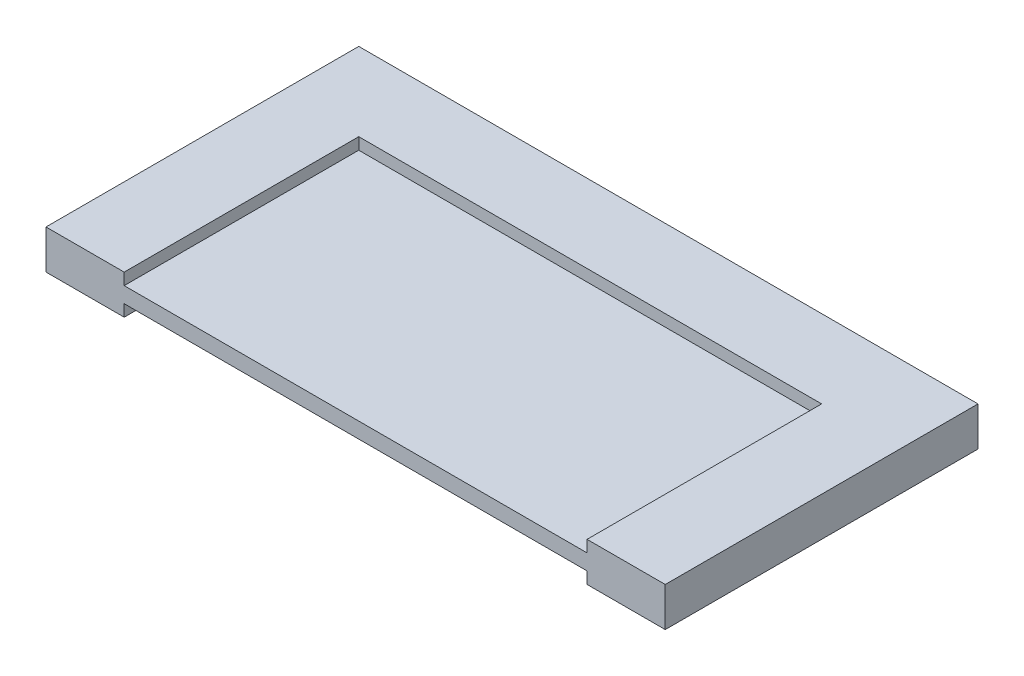
ISO-10303-21;
HEADER;
FILE_DESCRIPTION(('STEP AP214'),'2;1');
FILE_NAME('part.step','',(''),(''),'','','');
FILE_SCHEMA(('AUTOMOTIVE_DESIGN { 1 0 10303 214 1 1 1 1 }'));
ENDSEC;
DATA;
#1=APPLICATION_CONTEXT('core data for automotive mechanical design processes');
#2=APPLICATION_PROTOCOL_DEFINITION('international standard','automotive_design',2000,#1);
#3=PRODUCT_CONTEXT('',#1,'mechanical');
#4=PRODUCT('Part','Part','',(#3));
#5=PRODUCT_RELATED_PRODUCT_CATEGORY('part','',(#4));
#6=PRODUCT_DEFINITION_FORMATION('','',#4);
#7=PRODUCT_DEFINITION_CONTEXT('part definition',#1,'design');
#8=PRODUCT_DEFINITION('design','',#6,#7);
#9=PRODUCT_DEFINITION_SHAPE('','',#8);
#10=(LENGTH_UNIT() NAMED_UNIT(*) SI_UNIT(.MILLI.,.METRE.));
#11=(NAMED_UNIT(*) PLANE_ANGLE_UNIT() SI_UNIT($,.RADIAN.));
#12=(NAMED_UNIT(*) SI_UNIT($,.STERADIAN.) SOLID_ANGLE_UNIT());
#13=UNCERTAINTY_MEASURE_WITH_UNIT(LENGTH_MEASURE(1.E-05),#10,'distance_accuracy_value','');
#14=(GEOMETRIC_REPRESENTATION_CONTEXT(3) GLOBAL_UNCERTAINTY_ASSIGNED_CONTEXT((#13)) GLOBAL_UNIT_ASSIGNED_CONTEXT((#10,
#11,#12)) REPRESENTATION_CONTEXT('',''));
#15=CARTESIAN_POINT('',(0.,0.,0.));
#16=DIRECTION('',(0.,0.,1.));
#17=DIRECTION('',(1.,0.,0.));
#18=AXIS2_PLACEMENT_3D('',#15,#16,#17);
#19=CARTESIAN_POINT('',(-18.796,1.5875,0.));
#20=DIRECTION('',(-1.,0.,0.));
#21=DIRECTION('',(0.,0.,1.));
#22=AXIS2_PLACEMENT_3D('',#19,#20,#21);
#23=PLANE('',#22);
#24=DIRECTION('',(0.,0.,1.));
#25=VECTOR('',#24,1.);
#26=CARTESIAN_POINT('',(-18.796,-0.635,-19.05));
#27=LINE('',#26,#25);
#28=CARTESIAN_POINT('',(-18.796,-0.635,-19.05));
#29=VERTEX_POINT('',#28);
#30=CARTESIAN_POINT('',(-18.796,-0.635,0.));
#31=VERTEX_POINT('',#30);
#32=EDGE_CURVE('E189',#29,#31,#27,.T.);
#33=ORIENTED_EDGE('',*,*,#32,.T.);
#34=DIRECTION('',(0.,-1.,0.));
#35=VECTOR('',#34,1.);
#36=CARTESIAN_POINT('',(-18.796,1.5875,0.));
#37=LINE('',#36,#35);
#38=CARTESIAN_POINT('',(-18.796,-1.5875,0.));
#39=VERTEX_POINT('',#38);
#40=EDGE_CURVE('E175',#31,#39,#37,.T.);
#41=ORIENTED_EDGE('',*,*,#40,.T.);
#42=DIRECTION('',(0.,0.,-1.));
#43=VECTOR('',#42,1.);
#44=CARTESIAN_POINT('',(-18.796,-1.5875,0.));
#45=LINE('',#44,#43);
#46=CARTESIAN_POINT('',(-18.796,-1.5875,-19.05));
#47=VERTEX_POINT('',#46);
#48=EDGE_CURVE('E150',#39,#47,#45,.T.);
#49=ORIENTED_EDGE('',*,*,#48,.T.);
#50=DIRECTION('',(0.,-1.,0.));
#51=VECTOR('',#50,1.);
#52=CARTESIAN_POINT('',(-18.796,1.5875,-19.05));
#53=LINE('',#52,#51);
#54=EDGE_CURVE('E172',#29,#47,#53,.T.);
#55=ORIENTED_EDGE('',*,*,#54,.F.);
#56=EDGE_LOOP('',(#33,#41,#49,#55));
#57=FACE_BOUND('',#56,.T.);
#58=ADVANCED_FACE('F35',(#57),#23,.F.);
#59=CARTESIAN_POINT('',(-18.796,1.5875,-19.05));
#60=DIRECTION('',(0.,0.,-1.));
#61=DIRECTION('',(-1.,0.,0.));
#62=AXIS2_PLACEMENT_3D('',#59,#60,#61);
#63=PLANE('',#62);
#64=DIRECTION('',(-1.,0.,0.));
#65=VECTOR('',#64,1.);
#66=CARTESIAN_POINT('',(-18.796,-0.635,-19.05));
#67=LINE('',#66,#65);
#68=CARTESIAN_POINT('',(18.796,-0.635,-19.05));
#69=VERTEX_POINT('',#68);
#70=EDGE_CURVE('E200',#69,#29,#67,.T.);
#71=ORIENTED_EDGE('',*,*,#70,.T.);
#72=ORIENTED_EDGE('',*,*,#54,.T.);
#73=DIRECTION('',(1.,0.,0.));
#74=VECTOR('',#73,1.);
#75=CARTESIAN_POINT('',(-18.796,-1.5875,-19.05));
#76=LINE('',#75,#74);
#77=CARTESIAN_POINT('',(18.796,-1.5875,-19.05));
#78=VERTEX_POINT('',#77);
#79=EDGE_CURVE('E153',#47,#78,#76,.T.);
#80=ORIENTED_EDGE('',*,*,#79,.T.);
#81=DIRECTION('',(0.,-1.,0.));
#82=VECTOR('',#81,1.);
#83=CARTESIAN_POINT('',(18.796,1.5875,-19.05));
#84=LINE('',#83,#82);
#85=EDGE_CURVE('E168',#69,#78,#84,.T.);
#86=ORIENTED_EDGE('',*,*,#85,.F.);
#87=EDGE_LOOP('',(#71,#72,#80,#86));
#88=FACE_BOUND('',#87,.T.);
#89=ADVANCED_FACE('F198',(#88),#63,.F.);
#90=CARTESIAN_POINT('',(18.796,1.5875,0.));
#91=DIRECTION('',(1.,0.,0.));
#92=DIRECTION('',(0.,0.,-1.));
#93=AXIS2_PLACEMENT_3D('',#90,#91,#92);
#94=PLANE('',#93);
#95=DIRECTION('',(0.,0.,-1.));
#96=VECTOR('',#95,1.);
#97=CARTESIAN_POINT('',(18.796,-0.635,-19.05));
#98=LINE('',#97,#96);
#99=CARTESIAN_POINT('',(18.796,-0.635,0.));
#100=VERTEX_POINT('',#99);
#101=EDGE_CURVE('E50',#100,#69,#98,.T.);
#102=ORIENTED_EDGE('',*,*,#101,.T.);
#103=ORIENTED_EDGE('',*,*,#85,.T.);
#104=DIRECTION('',(0.,0.,1.));
#105=VECTOR('',#104,1.);
#106=CARTESIAN_POINT('',(18.796,-1.5875,0.));
#107=LINE('',#106,#105);
#108=CARTESIAN_POINT('',(18.796,-1.5875,0.));
#109=VERTEX_POINT('',#108);
#110=EDGE_CURVE('E156',#78,#109,#107,.T.);
#111=ORIENTED_EDGE('',*,*,#110,.T.);
#112=DIRECTION('',(0.,-1.,0.));
#113=VECTOR('',#112,1.);
#114=CARTESIAN_POINT('',(18.796,1.5875,0.));
#115=LINE('',#114,#113);
#116=EDGE_CURVE('E134',#100,#109,#115,.T.);
#117=ORIENTED_EDGE('',*,*,#116,.F.);
#118=EDGE_LOOP('',(#102,#103,#111,#117));
#119=FACE_BOUND('',#118,.T.);
#120=ADVANCED_FACE('F249',(#119),#94,.F.);
#121=CARTESIAN_POINT('',(-25.146,1.5875,-25.4));
#122=DIRECTION('',(1.,0.,0.));
#123=DIRECTION('',(0.,0.,-1.));
#124=AXIS2_PLACEMENT_3D('',#121,#122,#123);
#125=PLANE('',#124);
#126=DIRECTION('',(0.,0.,1.));
#127=VECTOR('',#126,1.);
#128=CARTESIAN_POINT('',(-25.146,-1.5875,-25.4));
#129=LINE('',#128,#127);
#130=CARTESIAN_POINT('',(-25.146,-1.5875,-25.4));
#131=VERTEX_POINT('',#130);
#132=CARTESIAN_POINT('',(-25.146,-1.5875,0.));
#133=VERTEX_POINT('',#132);
#134=EDGE_CURVE('E143',#131,#133,#129,.T.);
#135=ORIENTED_EDGE('',*,*,#134,.T.);
#136=DIRECTION('',(0.,-1.,0.));
#137=VECTOR('',#136,1.);
#138=CARTESIAN_POINT('',(-25.146,1.5875,0.));
#139=LINE('',#138,#137);
#140=CARTESIAN_POINT('',(-25.146,1.5875,0.));
#141=VERTEX_POINT('',#140);
#142=EDGE_CURVE('E11',#141,#133,#139,.T.);
#143=ORIENTED_EDGE('',*,*,#142,.F.);
#144=DIRECTION('',(0.,0.,1.));
#145=VECTOR('',#144,1.);
#146=CARTESIAN_POINT('',(-25.146,1.5875,-25.4));
#147=LINE('',#146,#145);
#148=CARTESIAN_POINT('',(-25.146,1.5875,-25.4));
#149=VERTEX_POINT('',#148);
#150=EDGE_CURVE('E163',#149,#141,#147,.T.);
#151=ORIENTED_EDGE('',*,*,#150,.F.);
#152=DIRECTION('',(0.,-1.,0.));
#153=VECTOR('',#152,1.);
#154=CARTESIAN_POINT('',(-25.146,1.5875,-25.4));
#155=LINE('',#154,#153);
#156=EDGE_CURVE('E139',#149,#131,#155,.T.);
#157=ORIENTED_EDGE('',*,*,#156,.T.);
#158=EDGE_LOOP('',(#135,#143,#151,#157));
#159=FACE_BOUND('',#158,.T.);
#160=ADVANCED_FACE('F37',(#159),#125,.F.);
#161=CARTESIAN_POINT('',(-18.796,1.5875,0.));
#162=VERTEX_POINT('',#161);
#163=CARTESIAN_POINT('',(-18.796,0.635,0.));
#164=VERTEX_POINT('',#163);
#165=EDGE_CURVE('E43',#162,#164,#37,.T.);
#166=ORIENTED_EDGE('',*,*,#165,.T.);
#167=DIRECTION('',(0.,0.,1.));
#168=VECTOR('',#167,1.);
#169=CARTESIAN_POINT('',(-18.796,0.635,-19.05));
#170=LINE('',#169,#168);
#171=CARTESIAN_POINT('',(-18.796,0.635,-19.05));
#172=VERTEX_POINT('',#171);
#173=EDGE_CURVE('E219',#172,#164,#170,.T.);
#174=ORIENTED_EDGE('',*,*,#173,.F.);
#175=CARTESIAN_POINT('',(-18.796,1.5875,-19.05));
#176=VERTEX_POINT('',#175);
#177=EDGE_CURVE('E173',#176,#172,#53,.T.);
#178=ORIENTED_EDGE('',*,*,#177,.F.);
#179=DIRECTION('',(0.,0.,-1.));
#180=VECTOR('',#179,1.);
#181=CARTESIAN_POINT('',(-18.796,1.5875,0.));
#182=LINE('',#181,#180);
#183=EDGE_CURVE('E235',#162,#176,#182,.T.);
#184=ORIENTED_EDGE('',*,*,#183,.F.);
#185=EDGE_LOOP('',(#166,#174,#178,#184));
#186=FACE_BOUND('',#185,.T.);
#187=ADVANCED_FACE('F242',(#186),#23,.F.);
#188=ORIENTED_EDGE('',*,*,#177,.T.);
#189=DIRECTION('',(-1.,0.,0.));
#190=VECTOR('',#189,1.);
#191=CARTESIAN_POINT('',(-18.796,0.635,-19.05));
#192=LINE('',#191,#190);
#193=CARTESIAN_POINT('',(18.796,0.635,-19.05));
#194=VERTEX_POINT('',#193);
#195=EDGE_CURVE('E147',#194,#172,#192,.T.);
#196=ORIENTED_EDGE('',*,*,#195,.F.);
#197=CARTESIAN_POINT('',(18.796,1.5875,-19.05));
#198=VERTEX_POINT('',#197);
#199=EDGE_CURVE('E169',#198,#194,#84,.T.);
#200=ORIENTED_EDGE('',*,*,#199,.F.);
#201=DIRECTION('',(1.,0.,0.));
#202=VECTOR('',#201,1.);
#203=CARTESIAN_POINT('',(-18.796,1.5875,-19.05));
#204=LINE('',#203,#202);
#205=EDGE_CURVE('E237',#176,#198,#204,.T.);
#206=ORIENTED_EDGE('',*,*,#205,.F.);
#207=EDGE_LOOP('',(#188,#196,#200,#206));
#208=FACE_BOUND('',#207,.T.);
#209=ADVANCED_FACE('F241',(#208),#63,.F.);
#210=ORIENTED_EDGE('',*,*,#199,.T.);
#211=DIRECTION('',(0.,0.,-1.));
#212=VECTOR('',#211,1.);
#213=CARTESIAN_POINT('',(18.796,0.635,-19.05));
#214=LINE('',#213,#212);
#215=CARTESIAN_POINT('',(18.796,0.635,0.));
#216=VERTEX_POINT('',#215);
#217=EDGE_CURVE('E217',#216,#194,#214,.T.);
#218=ORIENTED_EDGE('',*,*,#217,.F.);
#219=CARTESIAN_POINT('',(18.796,1.5875,0.));
#220=VERTEX_POINT('',#219);
#221=EDGE_CURVE('E166',#220,#216,#115,.T.);
#222=ORIENTED_EDGE('',*,*,#221,.F.);
#223=DIRECTION('',(0.,0.,1.));
#224=VECTOR('',#223,1.);
#225=CARTESIAN_POINT('',(18.796,1.5875,0.));
#226=LINE('',#225,#224);
#227=EDGE_CURVE('E123',#198,#220,#226,.T.);
#228=ORIENTED_EDGE('',*,*,#227,.F.);
#229=EDGE_LOOP('',(#210,#218,#222,#228));
#230=FACE_BOUND('',#229,.T.);
#231=ADVANCED_FACE('F222',(#230),#94,.F.);
#232=CARTESIAN_POINT('',(25.146,1.5875,0.));
#233=DIRECTION('',(0.,0.,-1.));
#234=DIRECTION('',(-1.,0.,0.));
#235=AXIS2_PLACEMENT_3D('',#232,#233,#234);
#236=PLANE('',#235);
#237=DIRECTION('',(1.,0.,0.));
#238=VECTOR('',#237,1.);
#239=CARTESIAN_POINT('',(25.146,-1.5875,0.));
#240=LINE('',#239,#238);
#241=CARTESIAN_POINT('',(25.146,-1.5875,0.));
#242=VERTEX_POINT('',#241);
#243=EDGE_CURVE('E131',#109,#242,#240,.T.);
#244=ORIENTED_EDGE('',*,*,#243,.T.);
#245=DIRECTION('',(0.,-1.,0.));
#246=VECTOR('',#245,1.);
#247=CARTESIAN_POINT('',(25.146,1.5875,0.));
#248=LINE('',#247,#246);
#249=CARTESIAN_POINT('',(25.146,1.5875,0.));
#250=VERTEX_POINT('',#249);
#251=EDGE_CURVE('E128',#250,#242,#248,.T.);
#252=ORIENTED_EDGE('',*,*,#251,.F.);
#253=DIRECTION('',(1.,0.,0.));
#254=VECTOR('',#253,1.);
#255=CARTESIAN_POINT('',(25.146,1.5875,0.));
#256=LINE('',#255,#254);
#257=EDGE_CURVE('E116',#220,#250,#256,.T.);
#258=ORIENTED_EDGE('',*,*,#257,.F.);
#259=ORIENTED_EDGE('',*,*,#221,.T.);
#260=DIRECTION('',(1.,0.,0.));
#261=VECTOR('',#260,1.);
#262=CARTESIAN_POINT('',(-18.796,0.635,0.));
#263=LINE('',#262,#261);
#264=EDGE_CURVE('E214',#164,#216,#263,.T.);
#265=ORIENTED_EDGE('',*,*,#264,.F.);
#266=ORIENTED_EDGE('',*,*,#165,.F.);
#267=DIRECTION('',(1.,0.,0.));
#268=VECTOR('',#267,1.);
#269=CARTESIAN_POINT('',(-25.146,1.5875,0.));
#270=LINE('',#269,#268);
#271=EDGE_CURVE('E100',#141,#162,#270,.T.);
#272=ORIENTED_EDGE('',*,*,#271,.F.);
#273=ORIENTED_EDGE('',*,*,#142,.T.);
#274=DIRECTION('',(1.,0.,0.));
#275=VECTOR('',#274,1.);
#276=CARTESIAN_POINT('',(-25.146,-1.5875,0.));
#277=LINE('',#276,#275);
#278=EDGE_CURVE('E146',#133,#39,#277,.T.);
#279=ORIENTED_EDGE('',*,*,#278,.T.);
#280=ORIENTED_EDGE('',*,*,#40,.F.);
#281=DIRECTION('',(1.,0.,0.));
#282=VECTOR('',#281,1.);
#283=CARTESIAN_POINT('',(-18.796,-0.635,0.));
#284=LINE('',#283,#282);
#285=EDGE_CURVE('E229',#31,#100,#284,.T.);
#286=ORIENTED_EDGE('',*,*,#285,.T.);
#287=ORIENTED_EDGE('',*,*,#116,.T.);
#288=EDGE_LOOP('',(#244,#252,#258,#259,#265,#266,#272,#273,#279,#280,#286,#287));
#289=FACE_BOUND('',#288,.T.);
#290=ADVANCED_FACE('F129',(#289),#236,.F.);
#291=CARTESIAN_POINT('',(25.146,1.5875,-25.4));
#292=DIRECTION('',(-1.,0.,0.));
#293=DIRECTION('',(0.,0.,1.));
#294=AXIS2_PLACEMENT_3D('',#291,#292,#293);
#295=PLANE('',#294);
#296=DIRECTION('',(0.,0.,-1.));
#297=VECTOR('',#296,1.);
#298=CARTESIAN_POINT('',(25.146,-1.5875,-25.4));
#299=LINE('',#298,#297);
#300=CARTESIAN_POINT('',(25.146,-1.5875,-25.4));
#301=VERTEX_POINT('',#300);
#302=EDGE_CURVE('E160',#242,#301,#299,.T.);
#303=ORIENTED_EDGE('',*,*,#302,.T.);
#304=DIRECTION('',(0.,-1.,0.));
#305=VECTOR('',#304,1.);
#306=CARTESIAN_POINT('',(25.146,1.5875,-25.4));
#307=LINE('',#306,#305);
#308=CARTESIAN_POINT('',(25.146,1.5875,-25.4));
#309=VERTEX_POINT('',#308);
#310=EDGE_CURVE('E135',#309,#301,#307,.T.);
#311=ORIENTED_EDGE('',*,*,#310,.F.);
#312=DIRECTION('',(0.,0.,-1.));
#313=VECTOR('',#312,1.);
#314=CARTESIAN_POINT('',(25.146,1.5875,-25.4));
#315=LINE('',#314,#313);
#316=EDGE_CURVE('E120',#250,#309,#315,.T.);
#317=ORIENTED_EDGE('',*,*,#316,.F.);
#318=ORIENTED_EDGE('',*,*,#251,.T.);
#319=EDGE_LOOP('',(#303,#311,#317,#318));
#320=FACE_BOUND('',#319,.T.);
#321=ADVANCED_FACE('F137',(#320),#295,.F.);
#322=CARTESIAN_POINT('',(25.146,1.5875,-25.4));
#323=DIRECTION('',(0.,0.,1.));
#324=DIRECTION('',(1.,0.,0.));
#325=AXIS2_PLACEMENT_3D('',#322,#323,#324);
#326=PLANE('',#325);
#327=DIRECTION('',(-1.,0.,0.));
#328=VECTOR('',#327,1.);
#329=CARTESIAN_POINT('',(25.146,-1.5875,-25.4));
#330=LINE('',#329,#328);
#331=EDGE_CURVE('E92',#301,#131,#330,.T.);
#332=ORIENTED_EDGE('',*,*,#331,.T.);
#333=ORIENTED_EDGE('',*,*,#156,.F.);
#334=DIRECTION('',(-1.,0.,0.));
#335=VECTOR('',#334,1.);
#336=CARTESIAN_POINT('',(25.146,1.5875,-25.4));
#337=LINE('',#336,#335);
#338=EDGE_CURVE('E59',#309,#149,#337,.T.);
#339=ORIENTED_EDGE('',*,*,#338,.F.);
#340=ORIENTED_EDGE('',*,*,#310,.T.);
#341=EDGE_LOOP('',(#332,#333,#339,#340));
#342=FACE_BOUND('',#341,.T.);
#343=ADVANCED_FACE('F266',(#342),#326,.F.);
#344=CARTESIAN_POINT('',(0.,1.5875,0.));
#345=DIRECTION('',(0.,1.,0.));
#346=DIRECTION('',(0.,0.,1.));
#347=AXIS2_PLACEMENT_3D('',#344,#345,#346);
#348=PLANE('',#347);
#349=ORIENTED_EDGE('',*,*,#150,.T.);
#350=ORIENTED_EDGE('',*,*,#271,.T.);
#351=ORIENTED_EDGE('',*,*,#183,.T.);
#352=ORIENTED_EDGE('',*,*,#205,.T.);
#353=ORIENTED_EDGE('',*,*,#227,.T.);
#354=ORIENTED_EDGE('',*,*,#257,.T.);
#355=ORIENTED_EDGE('',*,*,#316,.T.);
#356=ORIENTED_EDGE('',*,*,#338,.T.);
#357=EDGE_LOOP('',(#349,#350,#351,#352,#353,#354,#355,#356));
#358=FACE_BOUND('',#357,.T.);
#359=ADVANCED_FACE('F118',(#358),#348,.T.);
#360=CARTESIAN_POINT('',(0.,-1.5875,0.));
#361=DIRECTION('',(0.,1.,0.));
#362=DIRECTION('',(0.,0.,1.));
#363=AXIS2_PLACEMENT_3D('',#360,#361,#362);
#364=PLANE('',#363);
#365=ORIENTED_EDGE('',*,*,#134,.F.);
#366=ORIENTED_EDGE('',*,*,#331,.F.);
#367=ORIENTED_EDGE('',*,*,#302,.F.);
#368=ORIENTED_EDGE('',*,*,#243,.F.);
#369=ORIENTED_EDGE('',*,*,#110,.F.);
#370=ORIENTED_EDGE('',*,*,#79,.F.);
#371=ORIENTED_EDGE('',*,*,#48,.F.);
#372=ORIENTED_EDGE('',*,*,#278,.F.);
#373=EDGE_LOOP('',(#365,#366,#367,#368,#369,#370,#371,#372));
#374=FACE_BOUND('',#373,.T.);
#375=ADVANCED_FACE('F193',(#374),#364,.F.);
#376=CARTESIAN_POINT('',(0.,0.635,0.));
#377=DIRECTION('',(0.,1.,0.));
#378=DIRECTION('',(0.,0.,1.));
#379=AXIS2_PLACEMENT_3D('',#376,#377,#378);
#380=PLANE('',#379);
#381=ORIENTED_EDGE('',*,*,#173,.T.);
#382=ORIENTED_EDGE('',*,*,#264,.T.);
#383=ORIENTED_EDGE('',*,*,#217,.T.);
#384=ORIENTED_EDGE('',*,*,#195,.T.);
#385=EDGE_LOOP('',(#381,#382,#383,#384));
#386=FACE_BOUND('',#385,.T.);
#387=ADVANCED_FACE('F216',(#386),#380,.T.);
#388=CARTESIAN_POINT('',(0.,-0.635,0.));
#389=DIRECTION('',(0.,1.,0.));
#390=DIRECTION('',(0.,0.,1.));
#391=AXIS2_PLACEMENT_3D('',#388,#389,#390);
#392=PLANE('',#391);
#393=ORIENTED_EDGE('',*,*,#32,.F.);
#394=ORIENTED_EDGE('',*,*,#70,.F.);
#395=ORIENTED_EDGE('',*,*,#101,.F.);
#396=ORIENTED_EDGE('',*,*,#285,.F.);
#397=EDGE_LOOP('',(#393,#394,#395,#396));
#398=FACE_BOUND('',#397,.T.);
#399=ADVANCED_FACE('F273',(#398),#392,.F.);
#400=CLOSED_SHELL('',(#58,#89,#120,#160,#187,#209,#231,#290,#321,#343,#359,#375,#387,#399));
#401=MANIFOLD_SOLID_BREP('B2',#400);
#402=ADVANCED_BREP_SHAPE_REPRESENTATION('',(#18,#401),#14);
#403=SHAPE_DEFINITION_REPRESENTATION(#9,#402);
ENDSEC;
END-ISO-10303-21;
